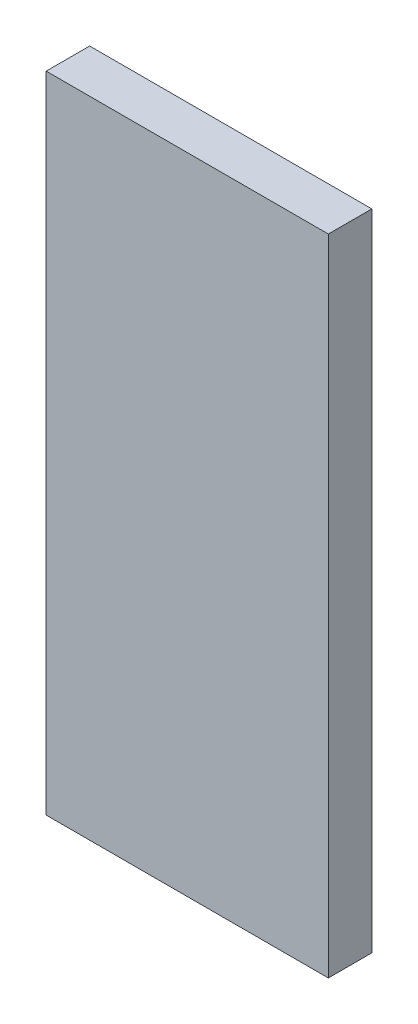
ISO-10303-21;
HEADER;
FILE_DESCRIPTION(('STEP AP214'),'2;1');
FILE_NAME('part.step','',(''),(''),'','','');
FILE_SCHEMA(('AUTOMOTIVE_DESIGN { 1 0 10303 214 1 1 1 1 }'));
ENDSEC;
DATA;
#1=APPLICATION_CONTEXT('core data for automotive mechanical design processes');
#2=APPLICATION_PROTOCOL_DEFINITION('international standard','automotive_design',2000,#1);
#3=PRODUCT_CONTEXT('',#1,'mechanical');
#4=PRODUCT('Part','Part','',(#3));
#5=PRODUCT_RELATED_PRODUCT_CATEGORY('part','',(#4));
#6=PRODUCT_DEFINITION_FORMATION('','',#4);
#7=PRODUCT_DEFINITION_CONTEXT('part definition',#1,'design');
#8=PRODUCT_DEFINITION('design','',#6,#7);
#9=PRODUCT_DEFINITION_SHAPE('','',#8);
#10=(LENGTH_UNIT() NAMED_UNIT(*) SI_UNIT(.MILLI.,.METRE.));
#11=(NAMED_UNIT(*) PLANE_ANGLE_UNIT() SI_UNIT($,.RADIAN.));
#12=(NAMED_UNIT(*) SI_UNIT($,.STERADIAN.) SOLID_ANGLE_UNIT());
#13=UNCERTAINTY_MEASURE_WITH_UNIT(LENGTH_MEASURE(1.E-05),#10,'distance_accuracy_value','');
#14=(GEOMETRIC_REPRESENTATION_CONTEXT(3) GLOBAL_UNCERTAINTY_ASSIGNED_CONTEXT((#13)) GLOBAL_UNIT_ASSIGNED_CONTEXT((#10,
#11,#12)) REPRESENTATION_CONTEXT('',''));
#15=CARTESIAN_POINT('',(0.,0.,0.));
#16=DIRECTION('',(0.,0.,1.));
#17=DIRECTION('',(1.,0.,0.));
#18=AXIS2_PLACEMENT_3D('',#15,#16,#17);
#19=CARTESIAN_POINT('',(30.,68.5,0.));
#20=DIRECTION('',(0.,1.,0.));
#21=DIRECTION('',(0.,0.,1.));
#22=AXIS2_PLACEMENT_3D('',#19,#20,#21);
#23=PLANE('',#22);
#24=DIRECTION('',(-1.,0.,0.));
#25=VECTOR('',#24,1.);
#26=CARTESIAN_POINT('',(30.,68.5,9.25));
#27=LINE('',#26,#25);
#28=CARTESIAN_POINT('',(30.,68.5,9.25));
#29=VERTEX_POINT('',#28);
#30=CARTESIAN_POINT('',(-30.,68.5,9.25));
#31=VERTEX_POINT('',#30);
#32=EDGE_CURVE('E103',#29,#31,#27,.T.);
#33=ORIENTED_EDGE('',*,*,#32,.F.);
#34=DIRECTION('',(0.,0.,1.));
#35=VECTOR('',#34,1.);
#36=CARTESIAN_POINT('',(30.,68.5,0.));
#37=LINE('',#36,#35);
#38=CARTESIAN_POINT('',(30.,68.5,0.));
#39=VERTEX_POINT('',#38);
#40=EDGE_CURVE('E11',#39,#29,#37,.T.);
#41=ORIENTED_EDGE('',*,*,#40,.F.);
#42=DIRECTION('',(-1.,0.,0.));
#43=VECTOR('',#42,1.);
#44=CARTESIAN_POINT('',(30.,68.5,0.));
#45=LINE('',#44,#43);
#46=CARTESIAN_POINT('',(-30.,68.5,0.));
#47=VERTEX_POINT('',#46);
#48=EDGE_CURVE('E97',#39,#47,#45,.T.);
#49=ORIENTED_EDGE('',*,*,#48,.T.);
#50=DIRECTION('',(0.,0.,1.));
#51=VECTOR('',#50,1.);
#52=CARTESIAN_POINT('',(-30.,68.5,0.));
#53=LINE('',#52,#51);
#54=EDGE_CURVE('E42',#47,#31,#53,.T.);
#55=ORIENTED_EDGE('',*,*,#54,.T.);
#56=EDGE_LOOP('',(#33,#41,#49,#55));
#57=FACE_BOUND('',#56,.T.);
#58=ADVANCED_FACE('F39',(#57),#23,.T.);
#59=CARTESIAN_POINT('',(30.,-68.5,0.));
#60=DIRECTION('',(1.,0.,0.));
#61=DIRECTION('',(0.,0.,-1.));
#62=AXIS2_PLACEMENT_3D('',#59,#60,#61);
#63=PLANE('',#62);
#64=DIRECTION('',(0.,1.,0.));
#65=VECTOR('',#64,1.);
#66=CARTESIAN_POINT('',(30.,-68.5,9.25));
#67=LINE('',#66,#65);
#68=CARTESIAN_POINT('',(30.,-68.5,9.25));
#69=VERTEX_POINT('',#68);
#70=EDGE_CURVE('E99',#69,#29,#67,.T.);
#71=ORIENTED_EDGE('',*,*,#70,.F.);
#72=DIRECTION('',(0.,0.,1.));
#73=VECTOR('',#72,1.);
#74=CARTESIAN_POINT('',(30.,-68.5,0.));
#75=LINE('',#74,#73);
#76=CARTESIAN_POINT('',(30.,-68.5,0.));
#77=VERTEX_POINT('',#76);
#78=EDGE_CURVE('E48',#77,#69,#75,.T.);
#79=ORIENTED_EDGE('',*,*,#78,.F.);
#80=DIRECTION('',(0.,1.,0.));
#81=VECTOR('',#80,1.);
#82=CARTESIAN_POINT('',(30.,-68.5,0.));
#83=LINE('',#82,#81);
#84=EDGE_CURVE('E94',#77,#39,#83,.T.);
#85=ORIENTED_EDGE('',*,*,#84,.T.);
#86=ORIENTED_EDGE('',*,*,#40,.T.);
#87=EDGE_LOOP('',(#71,#79,#85,#86));
#88=FACE_BOUND('',#87,.T.);
#89=ADVANCED_FACE('F113',(#88),#63,.T.);
#90=CARTESIAN_POINT('',(-30.,-68.5,0.));
#91=DIRECTION('',(0.,-1.,0.));
#92=DIRECTION('',(0.,0.,-1.));
#93=AXIS2_PLACEMENT_3D('',#90,#91,#92);
#94=PLANE('',#93);
#95=DIRECTION('',(1.,0.,0.));
#96=VECTOR('',#95,1.);
#97=CARTESIAN_POINT('',(-30.,-68.5,9.25));
#98=LINE('',#97,#96);
#99=CARTESIAN_POINT('',(-30.,-68.5,9.25));
#100=VERTEX_POINT('',#99);
#101=EDGE_CURVE('E89',#100,#69,#98,.T.);
#102=ORIENTED_EDGE('',*,*,#101,.F.);
#103=DIRECTION('',(0.,0.,1.));
#104=VECTOR('',#103,1.);
#105=CARTESIAN_POINT('',(-30.,-68.5,0.));
#106=LINE('',#105,#104);
#107=CARTESIAN_POINT('',(-30.,-68.5,0.));
#108=VERTEX_POINT('',#107);
#109=EDGE_CURVE('E84',#108,#100,#106,.T.);
#110=ORIENTED_EDGE('',*,*,#109,.F.);
#111=DIRECTION('',(1.,0.,0.));
#112=VECTOR('',#111,1.);
#113=CARTESIAN_POINT('',(-30.,-68.5,0.));
#114=LINE('',#113,#112);
#115=EDGE_CURVE('E87',#108,#77,#114,.T.);
#116=ORIENTED_EDGE('',*,*,#115,.T.);
#117=ORIENTED_EDGE('',*,*,#78,.T.);
#118=EDGE_LOOP('',(#102,#110,#116,#117));
#119=FACE_BOUND('',#118,.T.);
#120=ADVANCED_FACE('F86',(#119),#94,.T.);
#121=CARTESIAN_POINT('',(-30.,68.5,0.));
#122=DIRECTION('',(-1.,0.,0.));
#123=DIRECTION('',(0.,0.,1.));
#124=AXIS2_PLACEMENT_3D('',#121,#122,#123);
#125=PLANE('',#124);
#126=DIRECTION('',(0.,-1.,0.));
#127=VECTOR('',#126,1.);
#128=CARTESIAN_POINT('',(-30.,68.5,9.25));
#129=LINE('',#128,#127);
#130=EDGE_CURVE('E106',#31,#100,#129,.T.);
#131=ORIENTED_EDGE('',*,*,#130,.F.);
#132=ORIENTED_EDGE('',*,*,#54,.F.);
#133=DIRECTION('',(0.,-1.,0.));
#134=VECTOR('',#133,1.);
#135=CARTESIAN_POINT('',(-30.,68.5,0.));
#136=LINE('',#135,#134);
#137=EDGE_CURVE('E93',#47,#108,#136,.T.);
#138=ORIENTED_EDGE('',*,*,#137,.T.);
#139=ORIENTED_EDGE('',*,*,#109,.T.);
#140=EDGE_LOOP('',(#131,#132,#138,#139));
#141=FACE_BOUND('',#140,.T.);
#142=ADVANCED_FACE('F96',(#141),#125,.T.);
#143=CARTESIAN_POINT('',(0.,0.,0.));
#144=DIRECTION('',(0.,0.,1.));
#145=DIRECTION('',(1.,0.,0.));
#146=AXIS2_PLACEMENT_3D('',#143,#144,#145);
#147=PLANE('',#146);
#148=ORIENTED_EDGE('',*,*,#48,.F.);
#149=ORIENTED_EDGE('',*,*,#84,.F.);
#150=ORIENTED_EDGE('',*,*,#115,.F.);
#151=ORIENTED_EDGE('',*,*,#137,.F.);
#152=EDGE_LOOP('',(#148,#149,#150,#151));
#153=FACE_BOUND('',#152,.T.);
#154=ADVANCED_FACE('F92',(#153),#147,.F.);
#155=CARTESIAN_POINT('',(0.,0.,9.25));
#156=DIRECTION('',(0.,0.,1.));
#157=DIRECTION('',(1.,0.,0.));
#158=AXIS2_PLACEMENT_3D('',#155,#156,#157);
#159=PLANE('',#158);
#160=ORIENTED_EDGE('',*,*,#32,.T.);
#161=ORIENTED_EDGE('',*,*,#130,.T.);
#162=ORIENTED_EDGE('',*,*,#101,.T.);
#163=ORIENTED_EDGE('',*,*,#70,.T.);
#164=EDGE_LOOP('',(#160,#161,#162,#163));
#165=FACE_BOUND('',#164,.T.);
#166=ADVANCED_FACE('F112',(#165),#159,.T.);
#167=CLOSED_SHELL('',(#58,#89,#120,#142,#154,#166));
#168=MANIFOLD_SOLID_BREP('B2',#167);
#169=ADVANCED_BREP_SHAPE_REPRESENTATION('',(#18,#168),#14);
#170=SHAPE_DEFINITION_REPRESENTATION(#9,#169);
ENDSEC;
END-ISO-10303-21;
